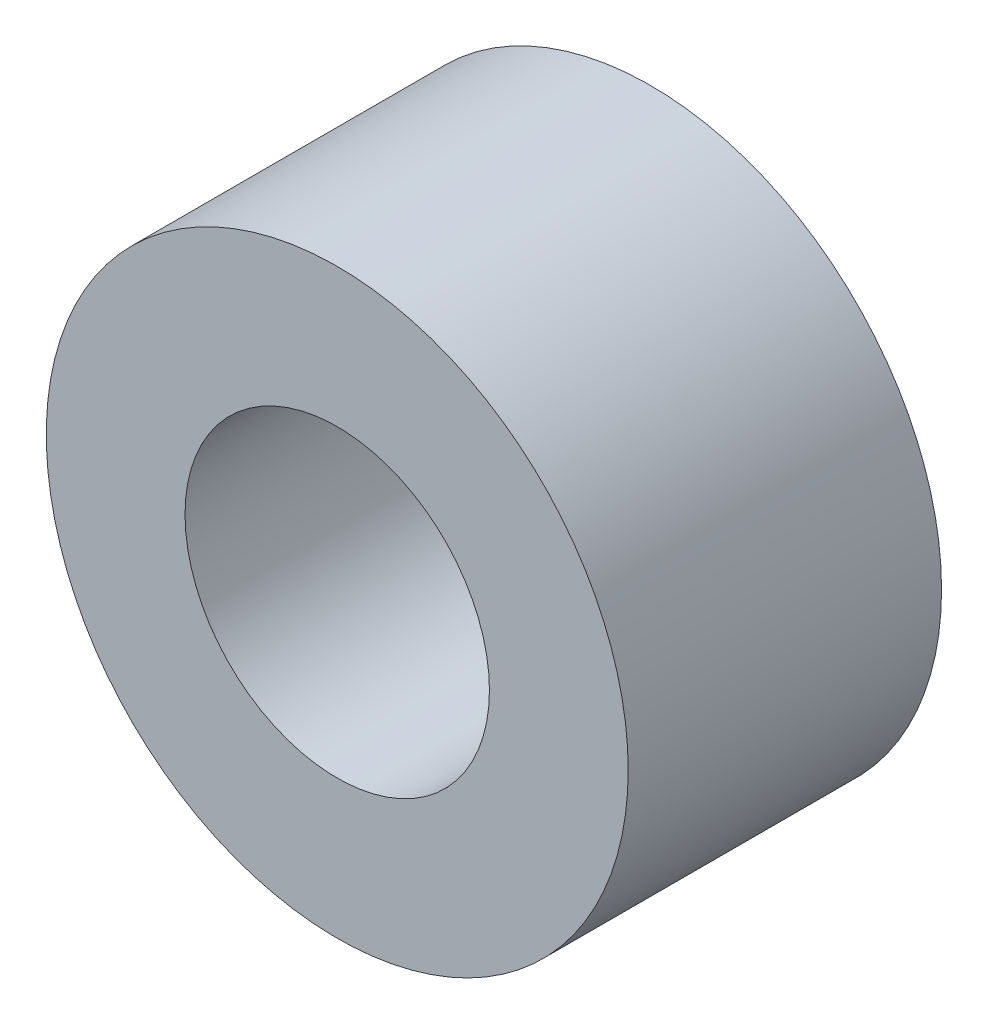
ISO-10303-21;
HEADER;
FILE_DESCRIPTION(('STEP AP214'),'2;1');
FILE_NAME('part.step','',(''),(''),'','','');
FILE_SCHEMA(('AUTOMOTIVE_DESIGN { 1 0 10303 214 1 1 1 1 }'));
ENDSEC;
DATA;
#1=APPLICATION_CONTEXT('core data for automotive mechanical design processes');
#2=APPLICATION_PROTOCOL_DEFINITION('international standard','automotive_design',2000,#1);
#3=PRODUCT_CONTEXT('',#1,'mechanical');
#4=PRODUCT('Part','Part','',(#3));
#5=PRODUCT_RELATED_PRODUCT_CATEGORY('part','',(#4));
#6=PRODUCT_DEFINITION_FORMATION('','',#4);
#7=PRODUCT_DEFINITION_CONTEXT('part definition',#1,'design');
#8=PRODUCT_DEFINITION('design','',#6,#7);
#9=PRODUCT_DEFINITION_SHAPE('','',#8);
#10=(LENGTH_UNIT() NAMED_UNIT(*) SI_UNIT(.MILLI.,.METRE.));
#11=(NAMED_UNIT(*) PLANE_ANGLE_UNIT() SI_UNIT($,.RADIAN.));
#12=(NAMED_UNIT(*) SI_UNIT($,.STERADIAN.) SOLID_ANGLE_UNIT());
#13=UNCERTAINTY_MEASURE_WITH_UNIT(LENGTH_MEASURE(1.E-05),#10,'distance_accuracy_value','');
#14=(GEOMETRIC_REPRESENTATION_CONTEXT(3) GLOBAL_UNCERTAINTY_ASSIGNED_CONTEXT((#13)) GLOBAL_UNIT_ASSIGNED_CONTEXT((#10,
#11,#12)) REPRESENTATION_CONTEXT('',''));
#15=CARTESIAN_POINT('',(0.,0.,0.));
#16=DIRECTION('',(0.,0.,1.));
#17=DIRECTION('',(1.,0.,0.));
#18=AXIS2_PLACEMENT_3D('',#15,#16,#17);
#19=CARTESIAN_POINT('',(0.,0.,3.5));
#20=DIRECTION('',(0.,0.,1.));
#21=DIRECTION('',(1.,0.,0.));
#22=AXIS2_PLACEMENT_3D('',#19,#20,#21);
#23=PLANE('',#22);
#24=CARTESIAN_POINT('',(0.,0.,3.5));
#25=DIRECTION('',(0.,0.,1.));
#26=DIRECTION('',(1.,0.,0.));
#27=AXIS2_PLACEMENT_3D('',#24,#25,#26);
#28=CIRCLE('',#27,3.25);
#29=CARTESIAN_POINT('',(3.25,0.,3.5));
#30=VERTEX_POINT('',#29);
#31=EDGE_CURVE('E10',#30,#30,#28,.T.);
#32=ORIENTED_EDGE('',*,*,#31,.T.);
#33=EDGE_LOOP('',(#32));
#34=FACE_BOUND('',#33,.T.);
#35=CARTESIAN_POINT('',(0.,0.,3.5));
#36=DIRECTION('',(0.,0.,1.));
#37=DIRECTION('',(1.,0.,0.));
#38=AXIS2_PLACEMENT_3D('',#35,#36,#37);
#39=CIRCLE('',#38,1.7);
#40=CARTESIAN_POINT('',(1.7,0.,3.5));
#41=VERTEX_POINT('',#40);
#42=EDGE_CURVE('E44',#41,#41,#39,.T.);
#43=ORIENTED_EDGE('',*,*,#42,.F.);
#44=EDGE_LOOP('',(#43));
#45=FACE_BOUND('',#44,.T.);
#46=ADVANCED_FACE('F33',(#34,#45),#23,.T.);
#47=CARTESIAN_POINT('',(0.,0.,0.));
#48=DIRECTION('',(0.,0.,1.));
#49=DIRECTION('',(1.,0.,0.));
#50=AXIS2_PLACEMENT_3D('',#47,#48,#49);
#51=PLANE('',#50);
#52=CARTESIAN_POINT('',(0.,0.,0.));
#53=DIRECTION('',(0.,0.,1.));
#54=DIRECTION('',(1.,0.,0.));
#55=AXIS2_PLACEMENT_3D('',#52,#53,#54);
#56=CIRCLE('',#55,3.25);
#57=CARTESIAN_POINT('',(3.25,0.,0.));
#58=VERTEX_POINT('',#57);
#59=EDGE_CURVE('E37',#58,#58,#56,.T.);
#60=ORIENTED_EDGE('',*,*,#59,.F.);
#61=EDGE_LOOP('',(#60));
#62=FACE_BOUND('',#61,.T.);
#63=CARTESIAN_POINT('',(0.,0.,0.));
#64=DIRECTION('',(0.,0.,1.));
#65=DIRECTION('',(1.,0.,0.));
#66=AXIS2_PLACEMENT_3D('',#63,#64,#65);
#67=CIRCLE('',#66,1.7);
#68=CARTESIAN_POINT('',(1.7,0.,0.));
#69=VERTEX_POINT('',#68);
#70=EDGE_CURVE('E46',#69,#69,#67,.T.);
#71=ORIENTED_EDGE('',*,*,#70,.T.);
#72=EDGE_LOOP('',(#71));
#73=FACE_BOUND('',#72,.T.);
#74=ADVANCED_FACE('F56',(#62,#73),#51,.F.);
#75=CARTESIAN_POINT('',(0.,0.,3.5));
#76=DIRECTION('',(0.,0.,-1.));
#77=DIRECTION('',(-1.,0.,0.));
#78=AXIS2_PLACEMENT_3D('',#75,#76,#77);
#79=CYLINDRICAL_SURFACE('',#78,3.25);
#80=ORIENTED_EDGE('',*,*,#31,.F.);
#81=EDGE_LOOP('',(#80));
#82=FACE_BOUND('',#81,.T.);
#83=ORIENTED_EDGE('',*,*,#59,.T.);
#84=EDGE_LOOP('',(#83));
#85=FACE_BOUND('',#84,.T.);
#86=ADVANCED_FACE('F35',(#82,#85),#79,.T.);
#87=CARTESIAN_POINT('',(0.,0.,3.5));
#88=DIRECTION('',(0.,0.,-1.));
#89=DIRECTION('',(-1.,0.,0.));
#90=AXIS2_PLACEMENT_3D('',#87,#88,#89);
#91=CYLINDRICAL_SURFACE('',#90,1.7);
#92=ORIENTED_EDGE('',*,*,#42,.T.);
#93=EDGE_LOOP('',(#92));
#94=FACE_BOUND('',#93,.T.);
#95=ORIENTED_EDGE('',*,*,#70,.F.);
#96=EDGE_LOOP('',(#95));
#97=FACE_BOUND('',#96,.T.);
#98=ADVANCED_FACE('F52',(#94,#97),#91,.F.);
#99=CLOSED_SHELL('',(#46,#74,#86,#98));
#100=MANIFOLD_SOLID_BREP('B2',#99);
#101=ADVANCED_BREP_SHAPE_REPRESENTATION('',(#18,#100),#14);
#102=SHAPE_DEFINITION_REPRESENTATION(#9,#101);
ENDSEC;
END-ISO-10303-21;
